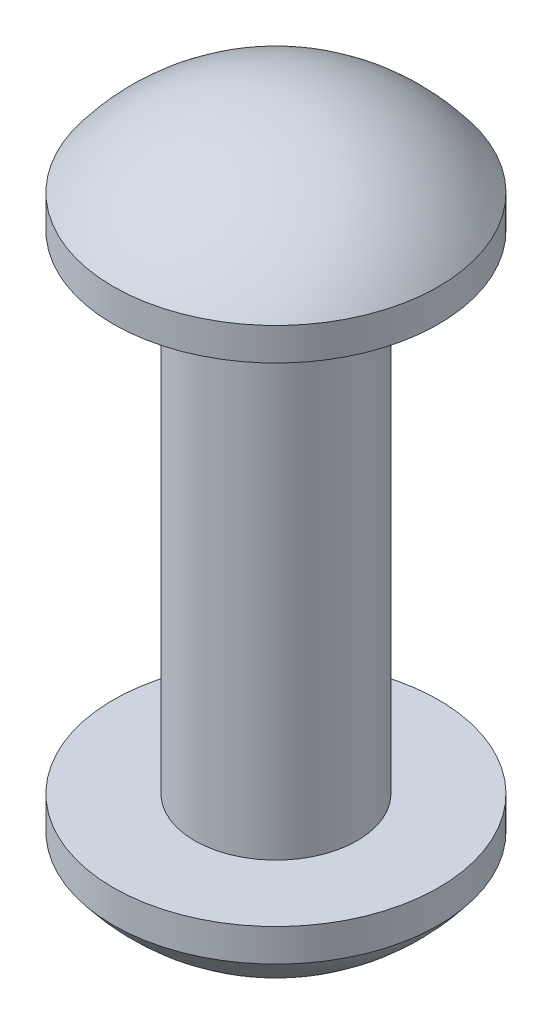
ISO-10303-21;
HEADER;
FILE_DESCRIPTION(('STEP AP214'),'2;1');
FILE_NAME('part.step','',(''),(''),'','','');
FILE_SCHEMA(('AUTOMOTIVE_DESIGN { 1 0 10303 214 1 1 1 1 }'));
ENDSEC;
DATA;
#1=APPLICATION_CONTEXT('core data for automotive mechanical design processes');
#2=APPLICATION_PROTOCOL_DEFINITION('international standard','automotive_design',2000,#1);
#3=PRODUCT_CONTEXT('',#1,'mechanical');
#4=PRODUCT('Part','Part','',(#3));
#5=PRODUCT_RELATED_PRODUCT_CATEGORY('part','',(#4));
#6=PRODUCT_DEFINITION_FORMATION('','',#4);
#7=PRODUCT_DEFINITION_CONTEXT('part definition',#1,'design');
#8=PRODUCT_DEFINITION('design','',#6,#7);
#9=PRODUCT_DEFINITION_SHAPE('','',#8);
#10=(LENGTH_UNIT() NAMED_UNIT(*) SI_UNIT(.MILLI.,.METRE.));
#11=(NAMED_UNIT(*) PLANE_ANGLE_UNIT() SI_UNIT($,.RADIAN.));
#12=(NAMED_UNIT(*) SI_UNIT($,.STERADIAN.) SOLID_ANGLE_UNIT());
#13=UNCERTAINTY_MEASURE_WITH_UNIT(LENGTH_MEASURE(1.E-05),#10,'distance_accuracy_value','');
#14=(GEOMETRIC_REPRESENTATION_CONTEXT(3) GLOBAL_UNCERTAINTY_ASSIGNED_CONTEXT((#13)) GLOBAL_UNIT_ASSIGNED_CONTEXT((#10,
#11,#12)) REPRESENTATION_CONTEXT('',''));
#15=CARTESIAN_POINT('',(0.,0.,0.));
#16=DIRECTION('',(0.,0.,1.));
#17=DIRECTION('',(1.,0.,0.));
#18=AXIS2_PLACEMENT_3D('',#15,#16,#17);
#19=CARTESIAN_POINT('',(0.,9.,0.));
#20=DIRECTION('',(0.,-1.,0.));
#21=DIRECTION('',(0.,0.,-1.));
#22=AXIS2_PLACEMENT_3D('',#19,#20,#21);
#23=CYLINDRICAL_SURFACE('',#22,3.);
#24=CARTESIAN_POINT('',(0.,9.,0.));
#25=DIRECTION('',(0.,1.,0.));
#26=DIRECTION('',(0.,0.,1.));
#27=AXIS2_PLACEMENT_3D('',#24,#25,#26);
#28=CIRCLE('',#27,3.);
#29=CARTESIAN_POINT('',(0.,9.,3.));
#30=VERTEX_POINT('',#29);
#31=EDGE_CURVE('E10',#30,#30,#28,.T.);
#32=ORIENTED_EDGE('',*,*,#31,.F.);
#33=EDGE_LOOP('',(#32));
#34=FACE_BOUND('',#33,.T.);
#35=CARTESIAN_POINT('',(0.,-9.,0.));
#36=DIRECTION('',(0.,1.,0.));
#37=DIRECTION('',(0.,0.,1.));
#38=AXIS2_PLACEMENT_3D('',#35,#36,#37);
#39=CIRCLE('',#38,3.);
#40=CARTESIAN_POINT('',(0.,-9.,3.));
#41=VERTEX_POINT('',#40);
#42=EDGE_CURVE('E52',#41,#41,#39,.T.);
#43=ORIENTED_EDGE('',*,*,#42,.T.);
#44=EDGE_LOOP('',(#43));
#45=FACE_BOUND('',#44,.T.);
#46=ADVANCED_FACE('F35',(#34,#45),#23,.T.);
#47=CARTESIAN_POINT('',(0.,10.2,0.));
#48=DIRECTION('',(0.,-1.,0.));
#49=DIRECTION('',(0.,0.,-1.));
#50=AXIS2_PLACEMENT_3D('',#47,#48,#49);
#51=CYLINDRICAL_SURFACE('',#50,6.);
#52=CARTESIAN_POINT('',(0.,10.2,0.));
#53=DIRECTION('',(0.,1.,0.));
#54=DIRECTION('',(0.,0.,1.));
#55=AXIS2_PLACEMENT_3D('',#52,#53,#54);
#56=CIRCLE('',#55,6.);
#57=CARTESIAN_POINT('',(0.,10.2,6.));
#58=VERTEX_POINT('',#57);
#59=EDGE_CURVE('E43',#58,#58,#56,.T.);
#60=ORIENTED_EDGE('',*,*,#59,.F.);
#61=EDGE_LOOP('',(#60));
#62=FACE_BOUND('',#61,.T.);
#63=CARTESIAN_POINT('',(0.,9.,0.));
#64=DIRECTION('',(0.,1.,0.));
#65=DIRECTION('',(0.,0.,1.));
#66=AXIS2_PLACEMENT_3D('',#63,#64,#65);
#67=CIRCLE('',#66,6.);
#68=CARTESIAN_POINT('',(0.,9.,6.));
#69=VERTEX_POINT('',#68);
#70=EDGE_CURVE('E48',#69,#69,#67,.T.);
#71=ORIENTED_EDGE('',*,*,#70,.T.);
#72=EDGE_LOOP('',(#71));
#73=FACE_BOUND('',#72,.T.);
#74=ADVANCED_FACE('F79',(#62,#73),#51,.T.);
#75=CARTESIAN_POINT('',(0.,5.7,0.));
#76=DIRECTION('',(0.,0.,1.));
#77=DIRECTION('',(1.,0.,0.));
#78=AXIS2_PLACEMENT_3D('',#75,#76,#77);
#79=SPHERICAL_SURFACE('',#78,7.5);
#80=CARTESIAN_POINT('',(0.,5.7,0.));
#81=DIRECTION('',(0.,1.,0.));
#82=DIRECTION('',(0.,0.,1.));
#83=AXIS2_PLACEMENT_3D('',#80,#81,#82);
#84=SPHERICAL_SURFACE('',#83,7.5);
#85=ORIENTED_EDGE('',*,*,#59,.T.);
#86=EDGE_LOOP('',(#85));
#87=FACE_BOUND('',#86,.T.);
#88=ADVANCED_FACE('F75',(#87),#84,.T.);
#89=CARTESIAN_POINT('',(0.,9.,0.));
#90=DIRECTION('',(0.,1.,0.));
#91=DIRECTION('',(0.,0.,1.));
#92=AXIS2_PLACEMENT_3D('',#89,#90,#91);
#93=PLANE('',#92);
#94=ORIENTED_EDGE('',*,*,#31,.T.);
#95=EDGE_LOOP('',(#94));
#96=FACE_BOUND('',#95,.T.);
#97=ORIENTED_EDGE('',*,*,#70,.F.);
#98=EDGE_LOOP('',(#97));
#99=FACE_BOUND('',#98,.T.);
#100=ADVANCED_FACE('F68',(#96,#99),#93,.F.);
#101=CARTESIAN_POINT('',(0.,-10.2,0.));
#102=DIRECTION('',(0.,1.,0.));
#103=DIRECTION('',(0.,0.,1.));
#104=AXIS2_PLACEMENT_3D('',#101,#102,#103);
#105=CYLINDRICAL_SURFACE('',#104,6.);
#106=CARTESIAN_POINT('',(0.,-10.2,0.));
#107=DIRECTION('',(0.,1.,0.));
#108=DIRECTION('',(0.,0.,1.));
#109=AXIS2_PLACEMENT_3D('',#106,#107,#108);
#110=CIRCLE('',#109,6.);
#111=CARTESIAN_POINT('',(0.,-10.2,6.));
#112=VERTEX_POINT('',#111);
#113=EDGE_CURVE('E39',#112,#112,#110,.T.);
#114=ORIENTED_EDGE('',*,*,#113,.T.);
#115=EDGE_LOOP('',(#114));
#116=FACE_BOUND('',#115,.T.);
#117=CARTESIAN_POINT('',(0.,-9.,0.));
#118=DIRECTION('',(0.,1.,0.));
#119=DIRECTION('',(0.,0.,1.));
#120=AXIS2_PLACEMENT_3D('',#117,#118,#119);
#121=CIRCLE('',#120,6.);
#122=CARTESIAN_POINT('',(0.,-9.,6.));
#123=VERTEX_POINT('',#122);
#124=EDGE_CURVE('E58',#123,#123,#121,.T.);
#125=ORIENTED_EDGE('',*,*,#124,.F.);
#126=EDGE_LOOP('',(#125));
#127=FACE_BOUND('',#126,.T.);
#128=ADVANCED_FACE('F66',(#116,#127),#105,.T.);
#129=CARTESIAN_POINT('',(0.,-5.7,0.));
#130=DIRECTION('',(0.,0.,1.));
#131=DIRECTION('',(1.,0.,0.));
#132=AXIS2_PLACEMENT_3D('',#129,#130,#131);
#133=SPHERICAL_SURFACE('',#132,7.5);
#134=CARTESIAN_POINT('',(0.,-5.7,0.));
#135=DIRECTION('',(0.,1.,0.));
#136=DIRECTION('',(0.,0.,1.));
#137=AXIS2_PLACEMENT_3D('',#134,#135,#136);
#138=SPHERICAL_SURFACE('',#137,7.5);
#139=ORIENTED_EDGE('',*,*,#113,.F.);
#140=EDGE_LOOP('',(#139));
#141=FACE_BOUND('',#140,.T.);
#142=ADVANCED_FACE('F37',(#141),#138,.T.);
#143=CARTESIAN_POINT('',(0.,-9.,0.));
#144=DIRECTION('',(0.,-1.,0.));
#145=DIRECTION('',(0.,0.,1.));
#146=AXIS2_PLACEMENT_3D('',#143,#144,#145);
#147=PLANE('',#146);
#148=ORIENTED_EDGE('',*,*,#42,.F.);
#149=EDGE_LOOP('',(#148));
#150=FACE_BOUND('',#149,.T.);
#151=ORIENTED_EDGE('',*,*,#124,.T.);
#152=EDGE_LOOP('',(#151));
#153=FACE_BOUND('',#152,.T.);
#154=ADVANCED_FACE('F64',(#150,#153),#147,.F.);
#155=CLOSED_SHELL('',(#46,#74,#88,#100,#128,#142,#154));
#156=MANIFOLD_SOLID_BREP('B2',#155);
#157=ADVANCED_BREP_SHAPE_REPRESENTATION('',(#18,#156),#14);
#158=SHAPE_DEFINITION_REPRESENTATION(#9,#157);
ENDSEC;
END-ISO-10303-21;
